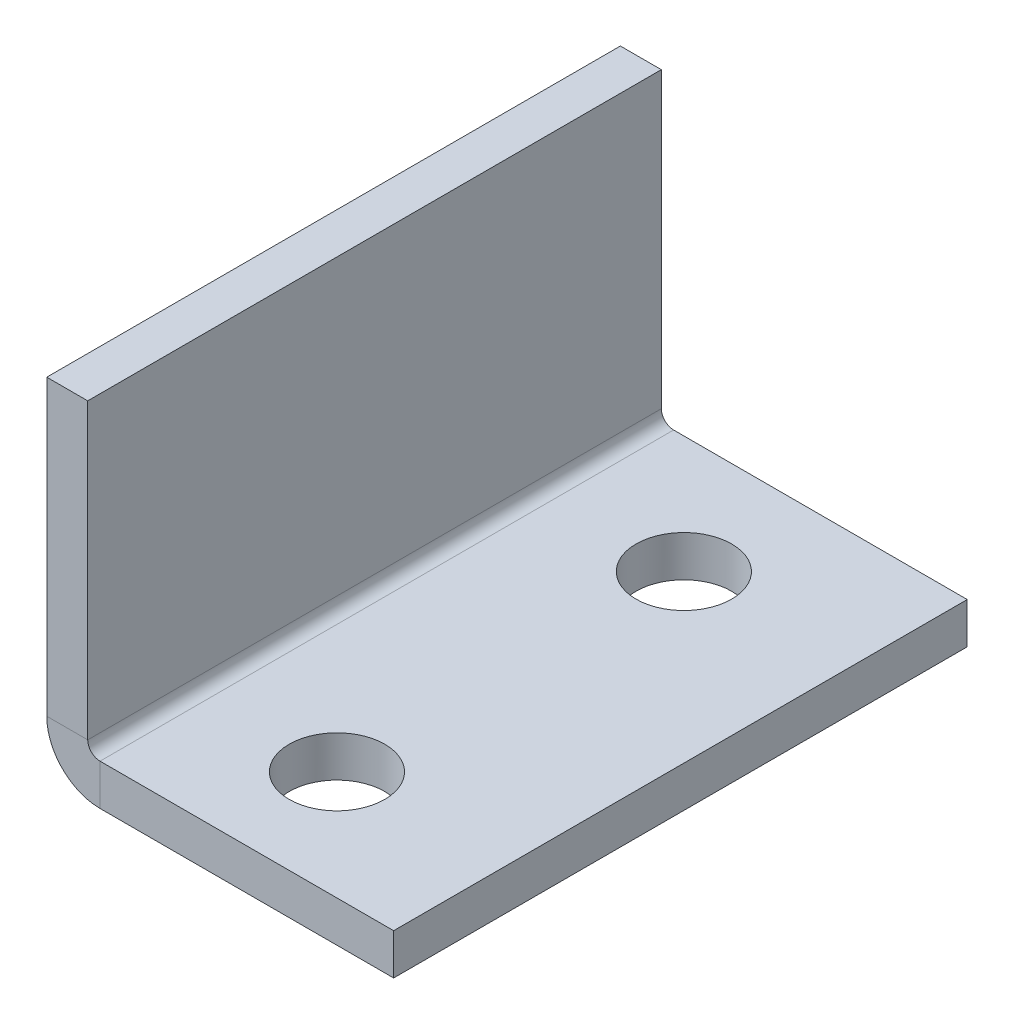
ISO-10303-21;
HEADER;
FILE_DESCRIPTION(('STEP AP214'),'2;1');
FILE_NAME('part.step','',(''),(''),'','','');
FILE_SCHEMA(('AUTOMOTIVE_DESIGN { 1 0 10303 214 1 1 1 1 }'));
ENDSEC;
DATA;
#1=APPLICATION_CONTEXT('core data for automotive mechanical design processes');
#2=APPLICATION_PROTOCOL_DEFINITION('international standard','automotive_design',2000,#1);
#3=PRODUCT_CONTEXT('',#1,'mechanical');
#4=PRODUCT('Part','Part','',(#3));
#5=PRODUCT_RELATED_PRODUCT_CATEGORY('part','',(#4));
#6=PRODUCT_DEFINITION_FORMATION('','',#4);
#7=PRODUCT_DEFINITION_CONTEXT('part definition',#1,'design');
#8=PRODUCT_DEFINITION('design','',#6,#7);
#9=PRODUCT_DEFINITION_SHAPE('','',#8);
#10=(LENGTH_UNIT() NAMED_UNIT(*) SI_UNIT(.MILLI.,.METRE.));
#11=(NAMED_UNIT(*) PLANE_ANGLE_UNIT() SI_UNIT($,.RADIAN.));
#12=(NAMED_UNIT(*) SI_UNIT($,.STERADIAN.) SOLID_ANGLE_UNIT());
#13=UNCERTAINTY_MEASURE_WITH_UNIT(LENGTH_MEASURE(1.E-05),#10,'distance_accuracy_value','');
#14=(GEOMETRIC_REPRESENTATION_CONTEXT(3) GLOBAL_UNCERTAINTY_ASSIGNED_CONTEXT((#13)) GLOBAL_UNIT_ASSIGNED_CONTEXT((#10,
#11,#12)) REPRESENTATION_CONTEXT('',''));
#15=CARTESIAN_POINT('',(0.,0.,0.));
#16=DIRECTION('',(0.,0.,1.));
#17=DIRECTION('',(1.,0.,0.));
#18=AXIS2_PLACEMENT_3D('',#15,#16,#17);
#19=CARTESIAN_POINT('',(0.,3.9,42.));
#20=DIRECTION('',(0.,0.,1.));
#21=DIRECTION('',(1.,0.,0.));
#22=AXIS2_PLACEMENT_3D('',#19,#20,#21);
#23=PLANE('',#22);
#24=DIRECTION('',(1.,0.,0.));
#25=VECTOR('',#24,1.);
#26=CARTESIAN_POINT('',(0.,3.9,42.));
#27=LINE('',#26,#25);
#28=CARTESIAN_POINT('',(0.,3.9,42.));
#29=VERTEX_POINT('',#28);
#30=CARTESIAN_POINT('',(3.,3.9,42.));
#31=VERTEX_POINT('',#30);
#32=EDGE_CURVE('E11',#29,#31,#27,.T.);
#33=ORIENTED_EDGE('',*,*,#32,.F.);
#34=CARTESIAN_POINT('',(3.9,3.9,42.));
#35=DIRECTION('',(0.,0.,-1.));
#36=DIRECTION('',(-1.,0.,0.));
#37=AXIS2_PLACEMENT_3D('',#34,#35,#36);
#38=CIRCLE('',#37,3.9);
#39=CARTESIAN_POINT('',(3.9,0.,42.));
#40=VERTEX_POINT('',#39);
#41=EDGE_CURVE('E135',#29,#40,#38,.F.);
#42=ORIENTED_EDGE('',*,*,#41,.T.);
#43=DIRECTION('',(0.,-1.,0.));
#44=VECTOR('',#43,1.);
#45=CARTESIAN_POINT('',(3.9,3.,42.));
#46=LINE('',#45,#44);
#47=CARTESIAN_POINT('',(3.9,3.,42.));
#48=VERTEX_POINT('',#47);
#49=EDGE_CURVE('E52',#48,#40,#46,.T.);
#50=ORIENTED_EDGE('',*,*,#49,.F.);
#51=CARTESIAN_POINT('',(3.9,3.9,42.));
#52=DIRECTION('',(0.,0.,1.));
#53=DIRECTION('',(1.,0.,0.));
#54=AXIS2_PLACEMENT_3D('',#51,#52,#53);
#55=CIRCLE('',#54,0.9);
#56=EDGE_CURVE('E142',#31,#48,#55,.T.);
#57=ORIENTED_EDGE('',*,*,#56,.F.);
#58=EDGE_LOOP('',(#33,#42,#50,#57));
#59=FACE_BOUND('',#58,.T.);
#60=ADVANCED_FACE('F43',(#59),#23,.T.);
#61=CARTESIAN_POINT('',(3.9,3.,42.));
#62=DIRECTION('',(0.,0.,1.));
#63=DIRECTION('',(1.,0.,0.));
#64=AXIS2_PLACEMENT_3D('',#61,#62,#63);
#65=PLANE('',#64);
#66=DIRECTION('',(0.,-1.,0.));
#67=VECTOR('',#66,1.);
#68=CARTESIAN_POINT('',(0.,25.4,42.));
#69=LINE('',#68,#67);
#70=CARTESIAN_POINT('',(0.,25.4,42.));
#71=VERTEX_POINT('',#70);
#72=EDGE_CURVE('E130',#71,#29,#69,.T.);
#73=ORIENTED_EDGE('',*,*,#72,.T.);
#74=ORIENTED_EDGE('',*,*,#32,.T.);
#75=DIRECTION('',(0.,1.,0.));
#76=VECTOR('',#75,1.);
#77=CARTESIAN_POINT('',(3.,25.4,42.));
#78=LINE('',#77,#76);
#79=CARTESIAN_POINT('',(3.,25.4,42.));
#80=VERTEX_POINT('',#79);
#81=EDGE_CURVE('E140',#80,#31,#78,.F.);
#82=ORIENTED_EDGE('',*,*,#81,.F.);
#83=DIRECTION('',(1.,0.,0.));
#84=VECTOR('',#83,1.);
#85=CARTESIAN_POINT('',(0.,25.4,42.));
#86=LINE('',#85,#84);
#87=EDGE_CURVE('E121',#71,#80,#86,.T.);
#88=ORIENTED_EDGE('',*,*,#87,.F.);
#89=EDGE_LOOP('',(#73,#74,#82,#88));
#90=FACE_BOUND('',#89,.T.);
#91=ADVANCED_FACE('F138',(#90),#65,.T.);
#92=CARTESIAN_POINT('',(3.9,0.,0.));
#93=DIRECTION('',(0.,0.,-1.));
#94=DIRECTION('',(-1.,0.,0.));
#95=AXIS2_PLACEMENT_3D('',#92,#93,#94);
#96=PLANE('',#95);
#97=DIRECTION('',(0.,1.,0.));
#98=VECTOR('',#97,1.);
#99=CARTESIAN_POINT('',(3.9,0.,0.));
#100=LINE('',#99,#98);
#101=CARTESIAN_POINT('',(3.9,0.,0.));
#102=VERTEX_POINT('',#101);
#103=CARTESIAN_POINT('',(3.9,3.,0.));
#104=VERTEX_POINT('',#103);
#105=EDGE_CURVE('E96',#102,#104,#100,.T.);
#106=ORIENTED_EDGE('',*,*,#105,.F.);
#107=CARTESIAN_POINT('',(3.9,3.9,0.));
#108=DIRECTION('',(0.,0.,-1.));
#109=DIRECTION('',(-1.,0.,0.));
#110=AXIS2_PLACEMENT_3D('',#107,#108,#109);
#111=CIRCLE('',#110,3.9);
#112=CARTESIAN_POINT('',(0.,3.9,0.));
#113=VERTEX_POINT('',#112);
#114=EDGE_CURVE('E164',#113,#102,#111,.F.);
#115=ORIENTED_EDGE('',*,*,#114,.F.);
#116=DIRECTION('',(-1.,0.,0.));
#117=VECTOR('',#116,1.);
#118=CARTESIAN_POINT('',(3.,3.9,0.));
#119=LINE('',#118,#117);
#120=CARTESIAN_POINT('',(3.,3.9,0.));
#121=VERTEX_POINT('',#120);
#122=EDGE_CURVE('E89',#121,#113,#119,.T.);
#123=ORIENTED_EDGE('',*,*,#122,.F.);
#124=CARTESIAN_POINT('',(3.9,3.9,0.));
#125=DIRECTION('',(0.,0.,1.));
#126=DIRECTION('',(1.,0.,0.));
#127=AXIS2_PLACEMENT_3D('',#124,#125,#126);
#128=CIRCLE('',#127,0.9);
#129=EDGE_CURVE('E157',#121,#104,#128,.T.);
#130=ORIENTED_EDGE('',*,*,#129,.T.);
#131=EDGE_LOOP('',(#106,#115,#123,#130));
#132=FACE_BOUND('',#131,.T.);
#133=ADVANCED_FACE('F218',(#132),#96,.T.);
#134=CARTESIAN_POINT('',(3.,3.9,0.));
#135=DIRECTION('',(0.,0.,-1.));
#136=DIRECTION('',(-1.,0.,0.));
#137=AXIS2_PLACEMENT_3D('',#134,#135,#136);
#138=PLANE('',#137);
#139=DIRECTION('',(1.,0.,0.));
#140=VECTOR('',#139,1.);
#141=CARTESIAN_POINT('',(0.,0.,0.));
#142=LINE('',#141,#140);
#143=CARTESIAN_POINT('',(25.4,0.,0.));
#144=VERTEX_POINT('',#143);
#145=EDGE_CURVE('E148',#102,#144,#142,.T.);
#146=ORIENTED_EDGE('',*,*,#145,.F.);
#147=ORIENTED_EDGE('',*,*,#105,.T.);
#148=DIRECTION('',(1.,0.,0.));
#149=VECTOR('',#148,1.);
#150=CARTESIAN_POINT('',(0.,3.,0.));
#151=LINE('',#150,#149);
#152=CARTESIAN_POINT('',(25.4,3.,0.));
#153=VERTEX_POINT('',#152);
#154=EDGE_CURVE('E154',#104,#153,#151,.T.);
#155=ORIENTED_EDGE('',*,*,#154,.T.);
#156=DIRECTION('',(0.,-1.,0.));
#157=VECTOR('',#156,1.);
#158=CARTESIAN_POINT('',(25.4,3.,0.));
#159=LINE('',#158,#157);
#160=EDGE_CURVE('E151',#153,#144,#159,.T.);
#161=ORIENTED_EDGE('',*,*,#160,.T.);
#162=EDGE_LOOP('',(#146,#147,#155,#161));
#163=FACE_BOUND('',#162,.T.);
#164=ADVANCED_FACE('F220',(#163),#138,.T.);
#165=CARTESIAN_POINT('',(0.,0.,42.));
#166=DIRECTION('',(0.,1.,0.));
#167=DIRECTION('',(0.,0.,1.));
#168=AXIS2_PLACEMENT_3D('',#165,#166,#167);
#169=PLANE('',#168);
#170=CARTESIAN_POINT('',(13.2500000000028,0.,33.999999999999));
#171=DIRECTION('',(0.,-1.,0.));
#172=DIRECTION('',(0.,0.,-1.));
#173=AXIS2_PLACEMENT_3D('',#170,#171,#172);
#174=CIRCLE('',#173,3.5);
#175=CARTESIAN_POINT('',(13.2500000000028,0.,30.499999999999));
#176=VERTEX_POINT('',#175);
#177=EDGE_CURVE('E184',#176,#176,#174,.T.);
#178=ORIENTED_EDGE('',*,*,#177,.F.);
#179=EDGE_LOOP('',(#178));
#180=FACE_BOUND('',#179,.T.);
#181=CARTESIAN_POINT('',(13.2500000000031,0.,8.59999999999898));
#182=DIRECTION('',(0.,-1.,0.));
#183=DIRECTION('',(0.,0.,-1.));
#184=AXIS2_PLACEMENT_3D('',#181,#182,#183);
#185=CIRCLE('',#184,3.5);
#186=CARTESIAN_POINT('',(13.2500000000031,0.,5.09999999999898));
#187=VERTEX_POINT('',#186);
#188=EDGE_CURVE('E189',#187,#187,#185,.T.);
#189=ORIENTED_EDGE('',*,*,#188,.F.);
#190=EDGE_LOOP('',(#189));
#191=FACE_BOUND('',#190,.T.);
#192=ORIENTED_EDGE('',*,*,#145,.T.);
#193=DIRECTION('',(0.,0.,-1.));
#194=VECTOR('',#193,1.);
#195=CARTESIAN_POINT('',(25.4,0.,42.));
#196=LINE('',#195,#194);
#197=CARTESIAN_POINT('',(25.4,0.,42.));
#198=VERTEX_POINT('',#197);
#199=EDGE_CURVE('E178',#198,#144,#196,.T.);
#200=ORIENTED_EDGE('',*,*,#199,.F.);
#201=DIRECTION('',(1.,0.,0.));
#202=VECTOR('',#201,1.);
#203=CARTESIAN_POINT('',(0.,0.,42.));
#204=LINE('',#203,#202);
#205=EDGE_CURVE('E102',#40,#198,#204,.T.);
#206=ORIENTED_EDGE('',*,*,#205,.F.);
#207=DIRECTION('',(0.,0.,-1.));
#208=VECTOR('',#207,1.);
#209=CARTESIAN_POINT('',(3.9,0.,42.));
#210=LINE('',#209,#208);
#211=EDGE_CURVE('E147',#40,#102,#210,.T.);
#212=ORIENTED_EDGE('',*,*,#211,.T.);
#213=EDGE_LOOP('',(#192,#200,#206,#212));
#214=FACE_BOUND('',#213,.T.);
#215=ADVANCED_FACE('F226',(#180,#191,#214),#169,.F.);
#216=CARTESIAN_POINT('',(25.4,3.,42.));
#217=DIRECTION('',(1.,0.,0.));
#218=DIRECTION('',(0.,0.,-1.));
#219=AXIS2_PLACEMENT_3D('',#216,#217,#218);
#220=PLANE('',#219);
#221=ORIENTED_EDGE('',*,*,#160,.F.);
#222=DIRECTION('',(0.,0.,-1.));
#223=VECTOR('',#222,1.);
#224=CARTESIAN_POINT('',(25.4,3.,42.));
#225=LINE('',#224,#223);
#226=CARTESIAN_POINT('',(25.4,3.,42.));
#227=VERTEX_POINT('',#226);
#228=EDGE_CURVE('E176',#227,#153,#225,.T.);
#229=ORIENTED_EDGE('',*,*,#228,.F.);
#230=DIRECTION('',(0.,-1.,0.));
#231=VECTOR('',#230,1.);
#232=CARTESIAN_POINT('',(25.4,3.,42.));
#233=LINE('',#232,#231);
#234=EDGE_CURVE('E197',#227,#198,#233,.T.);
#235=ORIENTED_EDGE('',*,*,#234,.T.);
#236=ORIENTED_EDGE('',*,*,#199,.T.);
#237=EDGE_LOOP('',(#221,#229,#235,#236));
#238=FACE_BOUND('',#237,.T.);
#239=ADVANCED_FACE('F256',(#238),#220,.T.);
#240=CARTESIAN_POINT('',(0.,3.,42.));
#241=DIRECTION('',(0.,1.,0.));
#242=DIRECTION('',(0.,0.,1.));
#243=AXIS2_PLACEMENT_3D('',#240,#241,#242);
#244=PLANE('',#243);
#245=CARTESIAN_POINT('',(13.2500000000028,3.,33.999999999999));
#246=DIRECTION('',(0.,1.,0.));
#247=DIRECTION('',(0.,0.,1.));
#248=AXIS2_PLACEMENT_3D('',#245,#246,#247);
#249=CIRCLE('',#248,3.5);
#250=CARTESIAN_POINT('',(13.2500000000028,3.,37.499999999999));
#251=VERTEX_POINT('',#250);
#252=EDGE_CURVE('E46',#251,#251,#249,.T.);
#253=ORIENTED_EDGE('',*,*,#252,.F.);
#254=EDGE_LOOP('',(#253));
#255=FACE_BOUND('',#254,.T.);
#256=CARTESIAN_POINT('',(13.2500000000031,3.,8.59999999999898));
#257=DIRECTION('',(0.,1.,0.));
#258=DIRECTION('',(0.,0.,1.));
#259=AXIS2_PLACEMENT_3D('',#256,#257,#258);
#260=CIRCLE('',#259,3.5);
#261=CARTESIAN_POINT('',(13.2500000000031,3.,12.099999999999));
#262=VERTEX_POINT('',#261);
#263=EDGE_CURVE('E182',#262,#262,#260,.T.);
#264=ORIENTED_EDGE('',*,*,#263,.F.);
#265=EDGE_LOOP('',(#264));
#266=FACE_BOUND('',#265,.T.);
#267=ORIENTED_EDGE('',*,*,#154,.F.);
#268=DIRECTION('',(0.,0.,-1.));
#269=VECTOR('',#268,1.);
#270=CARTESIAN_POINT('',(3.9,3.,42.));
#271=LINE('',#270,#269);
#272=EDGE_CURVE('E173',#48,#104,#271,.T.);
#273=ORIENTED_EDGE('',*,*,#272,.F.);
#274=DIRECTION('',(1.,0.,0.));
#275=VECTOR('',#274,1.);
#276=CARTESIAN_POINT('',(0.,3.,42.));
#277=LINE('',#276,#275);
#278=EDGE_CURVE('E200',#48,#227,#277,.T.);
#279=ORIENTED_EDGE('',*,*,#278,.T.);
#280=ORIENTED_EDGE('',*,*,#228,.T.);
#281=EDGE_LOOP('',(#267,#273,#279,#280));
#282=FACE_BOUND('',#281,.T.);
#283=ADVANCED_FACE('F261',(#255,#266,#282),#244,.T.);
#284=CARTESIAN_POINT('',(3.9,3.9,42.));
#285=DIRECTION('',(0.,0.,-1.));
#286=DIRECTION('',(-1.,0.,0.));
#287=AXIS2_PLACEMENT_3D('',#284,#285,#286);
#288=CYLINDRICAL_SURFACE('',#287,0.9);
#289=ORIENTED_EDGE('',*,*,#129,.F.);
#290=DIRECTION('',(0.,0.,-1.));
#291=VECTOR('',#290,1.);
#292=CARTESIAN_POINT('',(3.,3.9,42.));
#293=LINE('',#292,#291);
#294=EDGE_CURVE('E170',#31,#121,#293,.T.);
#295=ORIENTED_EDGE('',*,*,#294,.F.);
#296=ORIENTED_EDGE('',*,*,#56,.T.);
#297=ORIENTED_EDGE('',*,*,#272,.T.);
#298=EDGE_LOOP('',(#289,#295,#296,#297));
#299=FACE_BOUND('',#298,.T.);
#300=ADVANCED_FACE('F207',(#299),#288,.F.);
#301=CARTESIAN_POINT('',(3.,25.4,42.));
#302=DIRECTION('',(1.,0.,0.));
#303=DIRECTION('',(0.,0.,-1.));
#304=AXIS2_PLACEMENT_3D('',#301,#302,#303);
#305=PLANE('',#304);
#306=DIRECTION('',(0.,1.,0.));
#307=VECTOR('',#306,1.);
#308=CARTESIAN_POINT('',(3.,25.4,0.));
#309=LINE('',#308,#307);
#310=CARTESIAN_POINT('',(3.,25.4,0.));
#311=VERTEX_POINT('',#310);
#312=EDGE_CURVE('E159',#311,#121,#309,.F.);
#313=ORIENTED_EDGE('',*,*,#312,.F.);
#314=DIRECTION('',(0.,0.,-1.));
#315=VECTOR('',#314,1.);
#316=CARTESIAN_POINT('',(3.,25.4,42.));
#317=LINE('',#316,#315);
#318=EDGE_CURVE('E125',#80,#311,#317,.T.);
#319=ORIENTED_EDGE('',*,*,#318,.F.);
#320=ORIENTED_EDGE('',*,*,#81,.T.);
#321=ORIENTED_EDGE('',*,*,#294,.T.);
#322=EDGE_LOOP('',(#313,#319,#320,#321));
#323=FACE_BOUND('',#322,.T.);
#324=ADVANCED_FACE('F213',(#323),#305,.T.);
#325=CARTESIAN_POINT('',(0.,25.4,42.));
#326=DIRECTION('',(0.,1.,0.));
#327=DIRECTION('',(0.,0.,1.));
#328=AXIS2_PLACEMENT_3D('',#325,#326,#327);
#329=PLANE('',#328);
#330=DIRECTION('',(1.,0.,0.));
#331=VECTOR('',#330,1.);
#332=CARTESIAN_POINT('',(0.,25.4,0.));
#333=LINE('',#332,#331);
#334=CARTESIAN_POINT('',(0.,25.4,0.));
#335=VERTEX_POINT('',#334);
#336=EDGE_CURVE('E123',#335,#311,#333,.T.);
#337=ORIENTED_EDGE('',*,*,#336,.F.);
#338=DIRECTION('',(0.,0.,-1.));
#339=VECTOR('',#338,1.);
#340=CARTESIAN_POINT('',(0.,25.4,42.));
#341=LINE('',#340,#339);
#342=EDGE_CURVE('E117',#71,#335,#341,.T.);
#343=ORIENTED_EDGE('',*,*,#342,.F.);
#344=ORIENTED_EDGE('',*,*,#87,.T.);
#345=ORIENTED_EDGE('',*,*,#318,.T.);
#346=EDGE_LOOP('',(#337,#343,#344,#345));
#347=FACE_BOUND('',#346,.T.);
#348=ADVANCED_FACE('F119',(#347),#329,.T.);
#349=CARTESIAN_POINT('',(0.,25.4,42.));
#350=DIRECTION('',(1.,0.,0.));
#351=DIRECTION('',(0.,0.,-1.));
#352=AXIS2_PLACEMENT_3D('',#349,#350,#351);
#353=PLANE('',#352);
#354=DIRECTION('',(0.,-1.,0.));
#355=VECTOR('',#354,1.);
#356=CARTESIAN_POINT('',(0.,25.4,0.));
#357=LINE('',#356,#355);
#358=EDGE_CURVE('E162',#335,#113,#357,.T.);
#359=ORIENTED_EDGE('',*,*,#358,.T.);
#360=DIRECTION('',(0.,0.,-1.));
#361=VECTOR('',#360,1.);
#362=CARTESIAN_POINT('',(0.,3.9,42.));
#363=LINE('',#362,#361);
#364=EDGE_CURVE('E126',#29,#113,#363,.T.);
#365=ORIENTED_EDGE('',*,*,#364,.F.);
#366=ORIENTED_EDGE('',*,*,#72,.F.);
#367=ORIENTED_EDGE('',*,*,#342,.T.);
#368=EDGE_LOOP('',(#359,#365,#366,#367));
#369=FACE_BOUND('',#368,.T.);
#370=ADVANCED_FACE('F131',(#369),#353,.F.);
#371=CARTESIAN_POINT('',(3.9,3.9,42.));
#372=DIRECTION('',(0.,0.,-1.));
#373=DIRECTION('',(-1.,0.,0.));
#374=AXIS2_PLACEMENT_3D('',#371,#372,#373);
#375=CYLINDRICAL_SURFACE('',#374,3.9);
#376=ORIENTED_EDGE('',*,*,#114,.T.);
#377=ORIENTED_EDGE('',*,*,#211,.F.);
#378=ORIENTED_EDGE('',*,*,#41,.F.);
#379=ORIENTED_EDGE('',*,*,#364,.T.);
#380=EDGE_LOOP('',(#376,#377,#378,#379));
#381=FACE_BOUND('',#380,.T.);
#382=ADVANCED_FACE('F216',(#381),#375,.T.);
#383=CARTESIAN_POINT('',(3.9,3.9,42.));
#384=DIRECTION('',(0.,0.,1.));
#385=DIRECTION('',(1.,0.,0.));
#386=AXIS2_PLACEMENT_3D('',#383,#384,#385);
#387=PLANE('',#386);
#388=ORIENTED_EDGE('',*,*,#205,.T.);
#389=ORIENTED_EDGE('',*,*,#234,.F.);
#390=ORIENTED_EDGE('',*,*,#278,.F.);
#391=ORIENTED_EDGE('',*,*,#49,.T.);
#392=EDGE_LOOP('',(#388,#389,#390,#391));
#393=FACE_BOUND('',#392,.T.);
#394=ADVANCED_FACE('F310',(#393),#387,.T.);
#395=CARTESIAN_POINT('',(3.9,3.9,0.));
#396=DIRECTION('',(0.,0.,1.));
#397=DIRECTION('',(1.,0.,0.));
#398=AXIS2_PLACEMENT_3D('',#395,#396,#397);
#399=PLANE('',#398);
#400=ORIENTED_EDGE('',*,*,#312,.T.);
#401=ORIENTED_EDGE('',*,*,#122,.T.);
#402=ORIENTED_EDGE('',*,*,#358,.F.);
#403=ORIENTED_EDGE('',*,*,#336,.T.);
#404=EDGE_LOOP('',(#400,#401,#402,#403));
#405=FACE_BOUND('',#404,.T.);
#406=ADVANCED_FACE('F214',(#405),#399,.F.);
#407=CARTESIAN_POINT('',(13.2500000000031,25.4,8.59999999999898));
#408=DIRECTION('',(0.,-1.,0.));
#409=DIRECTION('',(0.,0.,-1.));
#410=AXIS2_PLACEMENT_3D('',#407,#408,#409);
#411=CYLINDRICAL_SURFACE('',#410,3.5);
#412=ORIENTED_EDGE('',*,*,#263,.T.);
#413=EDGE_LOOP('',(#412));
#414=FACE_BOUND('',#413,.T.);
#415=ORIENTED_EDGE('',*,*,#188,.T.);
#416=EDGE_LOOP('',(#415));
#417=FACE_BOUND('',#416,.T.);
#418=ADVANCED_FACE('F329',(#414,#417),#411,.F.);
#419=CARTESIAN_POINT('',(13.2500000000028,25.4,33.999999999999));
#420=DIRECTION('',(0.,-1.,0.));
#421=DIRECTION('',(0.,0.,-1.));
#422=AXIS2_PLACEMENT_3D('',#419,#420,#421);
#423=CYLINDRICAL_SURFACE('',#422,3.5);
#424=ORIENTED_EDGE('',*,*,#252,.T.);
#425=EDGE_LOOP('',(#424));
#426=FACE_BOUND('',#425,.T.);
#427=ORIENTED_EDGE('',*,*,#177,.T.);
#428=EDGE_LOOP('',(#427));
#429=FACE_BOUND('',#428,.T.);
#430=ADVANCED_FACE('F355',(#426,#429),#423,.F.);
#431=CLOSED_SHELL('',(#60,#91,#133,#164,#215,#239,#283,#300,#324,#348,#370,#382,#394,#406,#418,#430));
#432=MANIFOLD_SOLID_BREP('B2',#431);
#433=ADVANCED_BREP_SHAPE_REPRESENTATION('',(#18,#432),#14);
#434=SHAPE_DEFINITION_REPRESENTATION(#9,#433);
ENDSEC;
END-ISO-10303-21;
